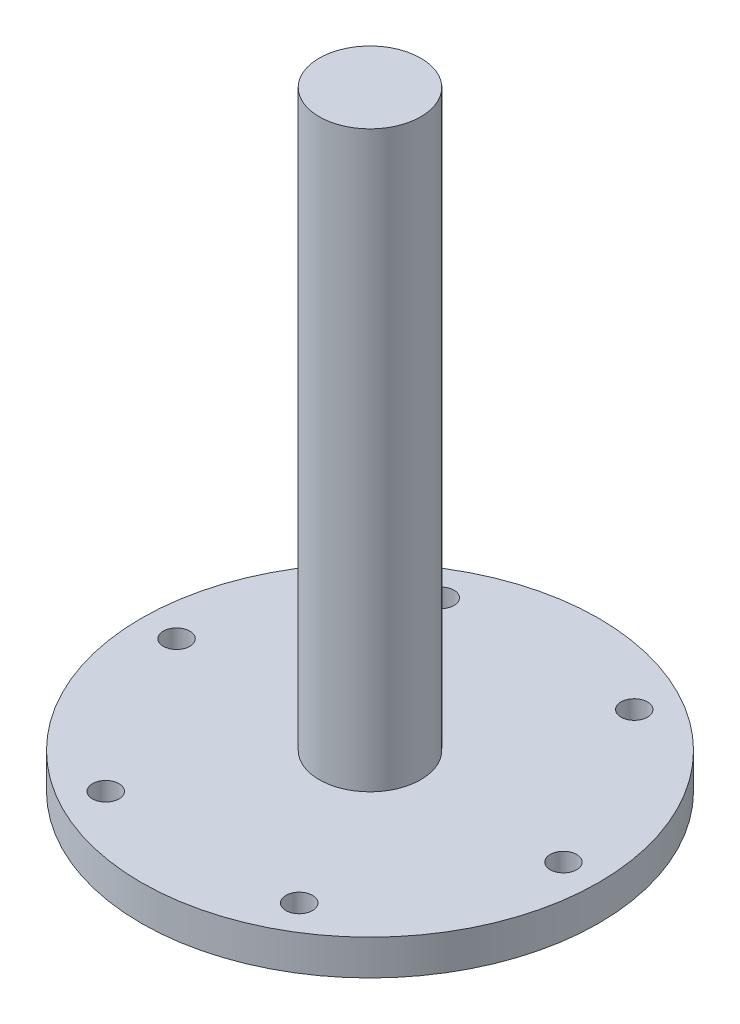
ISO-10303-21;
HEADER;
FILE_DESCRIPTION(('STEP AP214'),'2;1');
FILE_NAME('part.step','',(''),(''),'','','');
FILE_SCHEMA(('AUTOMOTIVE_DESIGN { 1 0 10303 214 1 1 1 1 }'));
ENDSEC;
DATA;
#1=APPLICATION_CONTEXT('core data for automotive mechanical design processes');
#2=APPLICATION_PROTOCOL_DEFINITION('international standard','automotive_design',2000,#1);
#3=PRODUCT_CONTEXT('',#1,'mechanical');
#4=PRODUCT('Part','Part','',(#3));
#5=PRODUCT_RELATED_PRODUCT_CATEGORY('part','',(#4));
#6=PRODUCT_DEFINITION_FORMATION('','',#4);
#7=PRODUCT_DEFINITION_CONTEXT('part definition',#1,'design');
#8=PRODUCT_DEFINITION('design','',#6,#7);
#9=PRODUCT_DEFINITION_SHAPE('','',#8);
#10=(LENGTH_UNIT() NAMED_UNIT(*) SI_UNIT(.MILLI.,.METRE.));
#11=(NAMED_UNIT(*) PLANE_ANGLE_UNIT() SI_UNIT($,.RADIAN.));
#12=(NAMED_UNIT(*) SI_UNIT($,.STERADIAN.) SOLID_ANGLE_UNIT());
#13=UNCERTAINTY_MEASURE_WITH_UNIT(LENGTH_MEASURE(1.E-05),#10,'distance_accuracy_value','');
#14=(GEOMETRIC_REPRESENTATION_CONTEXT(3) GLOBAL_UNCERTAINTY_ASSIGNED_CONTEXT((#13)) GLOBAL_UNIT_ASSIGNED_CONTEXT((#10,
#11,#12)) REPRESENTATION_CONTEXT('',''));
#15=CARTESIAN_POINT('',(0.,0.,0.));
#16=DIRECTION('',(0.,0.,1.));
#17=DIRECTION('',(1.,0.,0.));
#18=AXIS2_PLACEMENT_3D('',#15,#16,#17);
#19=CARTESIAN_POINT('',(0.,0.,0.));
#20=DIRECTION('',(0.,-1.,0.));
#21=DIRECTION('',(0.,0.,-1.));
#22=AXIS2_PLACEMENT_3D('',#19,#20,#21);
#23=CYLINDRICAL_SURFACE('',#22,5.75);
#24=CARTESIAN_POINT('',(0.,65.,0.));
#25=DIRECTION('',(0.,-1.,0.));
#26=DIRECTION('',(0.,0.,-1.));
#27=AXIS2_PLACEMENT_3D('',#24,#25,#26);
#28=CIRCLE('',#27,5.75);
#29=CARTESIAN_POINT('',(0.,65.,-5.75));
#30=VERTEX_POINT('',#29);
#31=EDGE_CURVE('E10',#30,#30,#28,.T.);
#32=ORIENTED_EDGE('',*,*,#31,.T.);
#33=EDGE_LOOP('',(#32));
#34=FACE_BOUND('',#33,.T.);
#35=CARTESIAN_POINT('',(0.,0.,0.));
#36=DIRECTION('',(0.,-1.,0.));
#37=DIRECTION('',(0.,0.,-1.));
#38=AXIS2_PLACEMENT_3D('',#35,#36,#37);
#39=CIRCLE('',#38,5.75);
#40=CARTESIAN_POINT('',(0.,0.,-5.75));
#41=VERTEX_POINT('',#40);
#42=EDGE_CURVE('E71',#41,#41,#39,.T.);
#43=ORIENTED_EDGE('',*,*,#42,.F.);
#44=EDGE_LOOP('',(#43));
#45=FACE_BOUND('',#44,.T.);
#46=ADVANCED_FACE('F37',(#34,#45),#23,.T.);
#47=CARTESIAN_POINT('',(5.75,65.,0.));
#48=DIRECTION('',(0.,1.,0.));
#49=DIRECTION('',(0.,0.,1.));
#50=AXIS2_PLACEMENT_3D('',#47,#48,#49);
#51=PLANE('',#50);
#52=ORIENTED_EDGE('',*,*,#31,.F.);
#53=EDGE_LOOP('',(#52));
#54=FACE_BOUND('',#53,.T.);
#55=ADVANCED_FACE('F112',(#54),#51,.T.);
#56=CARTESIAN_POINT('',(25.9,-4.,0.));
#57=DIRECTION('',(0.,-1.,0.));
#58=DIRECTION('',(0.,0.,-1.));
#59=AXIS2_PLACEMENT_3D('',#56,#57,#58);
#60=PLANE('',#59);
#61=CARTESIAN_POINT('',(21.9,-4.,0.));
#62=DIRECTION('',(0.,1.,0.));
#63=DIRECTION('',(0.,0.,1.));
#64=AXIS2_PLACEMENT_3D('',#61,#62,#63);
#65=CIRCLE('',#64,1.5);
#66=CARTESIAN_POINT('',(21.9,-4.,1.5));
#67=VERTEX_POINT('',#66);
#68=EDGE_CURVE('E57',#67,#67,#65,.T.);
#69=ORIENTED_EDGE('',*,*,#68,.T.);
#70=EDGE_LOOP('',(#69));
#71=FACE_BOUND('',#70,.T.);
#72=CARTESIAN_POINT('',(10.95,-4.,-18.9659563428792));
#73=DIRECTION('',(0.,1.,0.));
#74=DIRECTION('',(0.,0.,1.));
#75=AXIS2_PLACEMENT_3D('',#72,#73,#74);
#76=CIRCLE('',#75,1.5);
#77=CARTESIAN_POINT('',(10.95,-4.,-17.4659563428792));
#78=VERTEX_POINT('',#77);
#79=EDGE_CURVE('E85',#78,#78,#76,.T.);
#80=ORIENTED_EDGE('',*,*,#79,.T.);
#81=EDGE_LOOP('',(#80));
#82=FACE_BOUND('',#81,.T.);
#83=CARTESIAN_POINT('',(-10.95,-4.,-18.9659563428792));
#84=DIRECTION('',(0.,1.,0.));
#85=DIRECTION('',(0.,0.,1.));
#86=AXIS2_PLACEMENT_3D('',#83,#84,#85);
#87=CIRCLE('',#86,1.5);
#88=CARTESIAN_POINT('',(-10.95,-4.,-17.4659563428792));
#89=VERTEX_POINT('',#88);
#90=EDGE_CURVE('E81',#89,#89,#87,.T.);
#91=ORIENTED_EDGE('',*,*,#90,.T.);
#92=EDGE_LOOP('',(#91));
#93=FACE_BOUND('',#92,.T.);
#94=CARTESIAN_POINT('',(-21.9,-4.,0.));
#95=DIRECTION('',(0.,1.,0.));
#96=DIRECTION('',(0.,0.,1.));
#97=AXIS2_PLACEMENT_3D('',#94,#95,#96);
#98=CIRCLE('',#97,1.5);
#99=CARTESIAN_POINT('',(-21.9,-4.,1.5));
#100=VERTEX_POINT('',#99);
#101=EDGE_CURVE('E84',#100,#100,#98,.T.);
#102=ORIENTED_EDGE('',*,*,#101,.T.);
#103=EDGE_LOOP('',(#102));
#104=FACE_BOUND('',#103,.T.);
#105=CARTESIAN_POINT('',(-10.95,-4.,18.9659563428792));
#106=DIRECTION('',(0.,1.,0.));
#107=DIRECTION('',(0.,0.,1.));
#108=AXIS2_PLACEMENT_3D('',#105,#106,#107);
#109=CIRCLE('',#108,1.5);
#110=CARTESIAN_POINT('',(-10.95,-4.,20.4659563428792));
#111=VERTEX_POINT('',#110);
#112=EDGE_CURVE('E88',#111,#111,#109,.T.);
#113=ORIENTED_EDGE('',*,*,#112,.T.);
#114=EDGE_LOOP('',(#113));
#115=FACE_BOUND('',#114,.T.);
#116=CARTESIAN_POINT('',(10.95,-4.,18.9659563428792));
#117=DIRECTION('',(0.,1.,0.));
#118=DIRECTION('',(0.,0.,1.));
#119=AXIS2_PLACEMENT_3D('',#116,#117,#118);
#120=CIRCLE('',#119,1.5);
#121=CARTESIAN_POINT('',(10.95,-4.,20.4659563428792));
#122=VERTEX_POINT('',#121);
#123=EDGE_CURVE('E91',#122,#122,#120,.T.);
#124=ORIENTED_EDGE('',*,*,#123,.T.);
#125=EDGE_LOOP('',(#124));
#126=FACE_BOUND('',#125,.T.);
#127=CARTESIAN_POINT('',(0.,-4.,0.));
#128=DIRECTION('',(0.,-1.,0.));
#129=DIRECTION('',(0.,0.,-1.));
#130=AXIS2_PLACEMENT_3D('',#127,#128,#129);
#131=CIRCLE('',#130,25.9);
#132=CARTESIAN_POINT('',(0.,-4.,-25.9));
#133=VERTEX_POINT('',#132);
#134=EDGE_CURVE('E44',#133,#133,#131,.T.);
#135=ORIENTED_EDGE('',*,*,#134,.T.);
#136=EDGE_LOOP('',(#135));
#137=FACE_BOUND('',#136,.T.);
#138=ADVANCED_FACE('F99',(#71,#82,#93,#104,#115,#126,#137),#60,.T.);
#139=CARTESIAN_POINT('',(0.,0.,0.));
#140=DIRECTION('',(0.,-1.,0.));
#141=DIRECTION('',(0.,0.,-1.));
#142=AXIS2_PLACEMENT_3D('',#139,#140,#141);
#143=CYLINDRICAL_SURFACE('',#142,25.9);
#144=CARTESIAN_POINT('',(0.,0.,0.));
#145=DIRECTION('',(0.,-1.,0.));
#146=DIRECTION('',(0.,0.,-1.));
#147=AXIS2_PLACEMENT_3D('',#144,#145,#146);
#148=CIRCLE('',#147,25.9);
#149=CARTESIAN_POINT('',(0.,0.,-25.9));
#150=VERTEX_POINT('',#149);
#151=EDGE_CURVE('E49',#150,#150,#148,.T.);
#152=ORIENTED_EDGE('',*,*,#151,.T.);
#153=EDGE_LOOP('',(#152));
#154=FACE_BOUND('',#153,.T.);
#155=ORIENTED_EDGE('',*,*,#134,.F.);
#156=EDGE_LOOP('',(#155));
#157=FACE_BOUND('',#156,.T.);
#158=ADVANCED_FACE('F122',(#154,#157),#143,.T.);
#159=CARTESIAN_POINT('',(5.75,0.,0.));
#160=DIRECTION('',(0.,1.,0.));
#161=DIRECTION('',(0.,0.,1.));
#162=AXIS2_PLACEMENT_3D('',#159,#160,#161);
#163=PLANE('',#162);
#164=CARTESIAN_POINT('',(21.9,0.,0.));
#165=DIRECTION('',(0.,1.,0.));
#166=DIRECTION('',(0.,0.,1.));
#167=AXIS2_PLACEMENT_3D('',#164,#165,#166);
#168=CIRCLE('',#167,1.5);
#169=CARTESIAN_POINT('',(21.9,0.,1.5));
#170=VERTEX_POINT('',#169);
#171=EDGE_CURVE('E40',#170,#170,#168,.T.);
#172=ORIENTED_EDGE('',*,*,#171,.F.);
#173=EDGE_LOOP('',(#172));
#174=FACE_BOUND('',#173,.T.);
#175=CARTESIAN_POINT('',(10.95,0.,-18.9659563428792));
#176=DIRECTION('',(0.,1.,0.));
#177=DIRECTION('',(0.,0.,1.));
#178=AXIS2_PLACEMENT_3D('',#175,#176,#177);
#179=CIRCLE('',#178,1.5);
#180=CARTESIAN_POINT('',(10.95,0.,-17.4659563428792));
#181=VERTEX_POINT('',#180);
#182=EDGE_CURVE('E65',#181,#181,#179,.T.);
#183=ORIENTED_EDGE('',*,*,#182,.F.);
#184=EDGE_LOOP('',(#183));
#185=FACE_BOUND('',#184,.T.);
#186=CARTESIAN_POINT('',(-10.95,0.,-18.9659563428792));
#187=DIRECTION('',(0.,1.,0.));
#188=DIRECTION('',(0.,0.,1.));
#189=AXIS2_PLACEMENT_3D('',#186,#187,#188);
#190=CIRCLE('',#189,1.5);
#191=CARTESIAN_POINT('',(-10.95,0.,-17.4659563428792));
#192=VERTEX_POINT('',#191);
#193=EDGE_CURVE('E63',#192,#192,#190,.T.);
#194=ORIENTED_EDGE('',*,*,#193,.F.);
#195=EDGE_LOOP('',(#194));
#196=FACE_BOUND('',#195,.T.);
#197=CARTESIAN_POINT('',(-21.9,0.,0.));
#198=DIRECTION('',(0.,1.,0.));
#199=DIRECTION('',(0.,0.,1.));
#200=AXIS2_PLACEMENT_3D('',#197,#198,#199);
#201=CIRCLE('',#200,1.5);
#202=CARTESIAN_POINT('',(-21.9,0.,1.5));
#203=VERTEX_POINT('',#202);
#204=EDGE_CURVE('E60',#203,#203,#201,.T.);
#205=ORIENTED_EDGE('',*,*,#204,.F.);
#206=EDGE_LOOP('',(#205));
#207=FACE_BOUND('',#206,.T.);
#208=CARTESIAN_POINT('',(-10.95,0.,18.9659563428792));
#209=DIRECTION('',(0.,1.,0.));
#210=DIRECTION('',(0.,0.,1.));
#211=AXIS2_PLACEMENT_3D('',#208,#209,#210);
#212=CIRCLE('',#211,1.5);
#213=CARTESIAN_POINT('',(-10.95,0.,20.4659563428792));
#214=VERTEX_POINT('',#213);
#215=EDGE_CURVE('E56',#214,#214,#212,.T.);
#216=ORIENTED_EDGE('',*,*,#215,.F.);
#217=EDGE_LOOP('',(#216));
#218=FACE_BOUND('',#217,.T.);
#219=CARTESIAN_POINT('',(10.95,0.,18.9659563428792));
#220=DIRECTION('',(0.,1.,0.));
#221=DIRECTION('',(0.,0.,1.));
#222=AXIS2_PLACEMENT_3D('',#219,#220,#221);
#223=CIRCLE('',#222,1.5);
#224=CARTESIAN_POINT('',(10.95,0.,20.4659563428792));
#225=VERTEX_POINT('',#224);
#226=EDGE_CURVE('E53',#225,#225,#223,.T.);
#227=ORIENTED_EDGE('',*,*,#226,.F.);
#228=EDGE_LOOP('',(#227));
#229=FACE_BOUND('',#228,.T.);
#230=ORIENTED_EDGE('',*,*,#42,.T.);
#231=EDGE_LOOP('',(#230));
#232=FACE_BOUND('',#231,.T.);
#233=ORIENTED_EDGE('',*,*,#151,.F.);
#234=EDGE_LOOP('',(#233));
#235=FACE_BOUND('',#234,.T.);
#236=ADVANCED_FACE('F127',(#174,#185,#196,#207,#218,#229,#232,#235),#163,.T.);
#237=CARTESIAN_POINT('',(10.95,-4.,18.9659563428792));
#238=DIRECTION('',(0.,1.,0.));
#239=DIRECTION('',(0.,0.,1.));
#240=AXIS2_PLACEMENT_3D('',#237,#238,#239);
#241=CYLINDRICAL_SURFACE('',#240,1.5);
#242=ORIENTED_EDGE('',*,*,#226,.T.);
#243=EDGE_LOOP('',(#242));
#244=FACE_BOUND('',#243,.T.);
#245=ORIENTED_EDGE('',*,*,#123,.F.);
#246=EDGE_LOOP('',(#245));
#247=FACE_BOUND('',#246,.T.);
#248=ADVANCED_FACE('F131',(#244,#247),#241,.F.);
#249=CARTESIAN_POINT('',(-10.95,-4.,18.9659563428792));
#250=DIRECTION('',(0.,1.,0.));
#251=DIRECTION('',(0.,0.,1.));
#252=AXIS2_PLACEMENT_3D('',#249,#250,#251);
#253=CYLINDRICAL_SURFACE('',#252,1.5);
#254=ORIENTED_EDGE('',*,*,#215,.T.);
#255=EDGE_LOOP('',(#254));
#256=FACE_BOUND('',#255,.T.);
#257=ORIENTED_EDGE('',*,*,#112,.F.);
#258=EDGE_LOOP('',(#257));
#259=FACE_BOUND('',#258,.T.);
#260=ADVANCED_FACE('F139',(#256,#259),#253,.F.);
#261=CARTESIAN_POINT('',(-21.9,-4.,0.));
#262=DIRECTION('',(0.,1.,0.));
#263=DIRECTION('',(0.,0.,1.));
#264=AXIS2_PLACEMENT_3D('',#261,#262,#263);
#265=CYLINDRICAL_SURFACE('',#264,1.5);
#266=ORIENTED_EDGE('',*,*,#204,.T.);
#267=EDGE_LOOP('',(#266));
#268=FACE_BOUND('',#267,.T.);
#269=ORIENTED_EDGE('',*,*,#101,.F.);
#270=EDGE_LOOP('',(#269));
#271=FACE_BOUND('',#270,.T.);
#272=ADVANCED_FACE('F135',(#268,#271),#265,.F.);
#273=CARTESIAN_POINT('',(-10.95,-4.,-18.9659563428792));
#274=DIRECTION('',(0.,1.,0.));
#275=DIRECTION('',(0.,0.,1.));
#276=AXIS2_PLACEMENT_3D('',#273,#274,#275);
#277=CYLINDRICAL_SURFACE('',#276,1.5);
#278=ORIENTED_EDGE('',*,*,#193,.T.);
#279=EDGE_LOOP('',(#278));
#280=FACE_BOUND('',#279,.T.);
#281=ORIENTED_EDGE('',*,*,#90,.F.);
#282=EDGE_LOOP('',(#281));
#283=FACE_BOUND('',#282,.T.);
#284=ADVANCED_FACE('F109',(#280,#283),#277,.F.);
#285=CARTESIAN_POINT('',(10.95,-4.,-18.9659563428792));
#286=DIRECTION('',(0.,1.,0.));
#287=DIRECTION('',(0.,0.,1.));
#288=AXIS2_PLACEMENT_3D('',#285,#286,#287);
#289=CYLINDRICAL_SURFACE('',#288,1.5);
#290=ORIENTED_EDGE('',*,*,#182,.T.);
#291=EDGE_LOOP('',(#290));
#292=FACE_BOUND('',#291,.T.);
#293=ORIENTED_EDGE('',*,*,#79,.F.);
#294=EDGE_LOOP('',(#293));
#295=FACE_BOUND('',#294,.T.);
#296=ADVANCED_FACE('F104',(#292,#295),#289,.F.);
#297=CARTESIAN_POINT('',(21.9,-4.,0.));
#298=DIRECTION('',(0.,1.,0.));
#299=DIRECTION('',(0.,0.,1.));
#300=AXIS2_PLACEMENT_3D('',#297,#298,#299);
#301=CYLINDRICAL_SURFACE('',#300,1.5);
#302=ORIENTED_EDGE('',*,*,#171,.T.);
#303=EDGE_LOOP('',(#302));
#304=FACE_BOUND('',#303,.T.);
#305=ORIENTED_EDGE('',*,*,#68,.F.);
#306=EDGE_LOOP('',(#305));
#307=FACE_BOUND('',#306,.T.);
#308=ADVANCED_FACE('F102',(#304,#307),#301,.F.);
#309=CLOSED_SHELL('',(#46,#55,#138,#158,#236,#248,#260,#272,#284,#296,#308));
#310=MANIFOLD_SOLID_BREP('B2',#309);
#311=ADVANCED_BREP_SHAPE_REPRESENTATION('',(#18,#310),#14);
#312=SHAPE_DEFINITION_REPRESENTATION(#9,#311);
ENDSEC;
END-ISO-10303-21;
